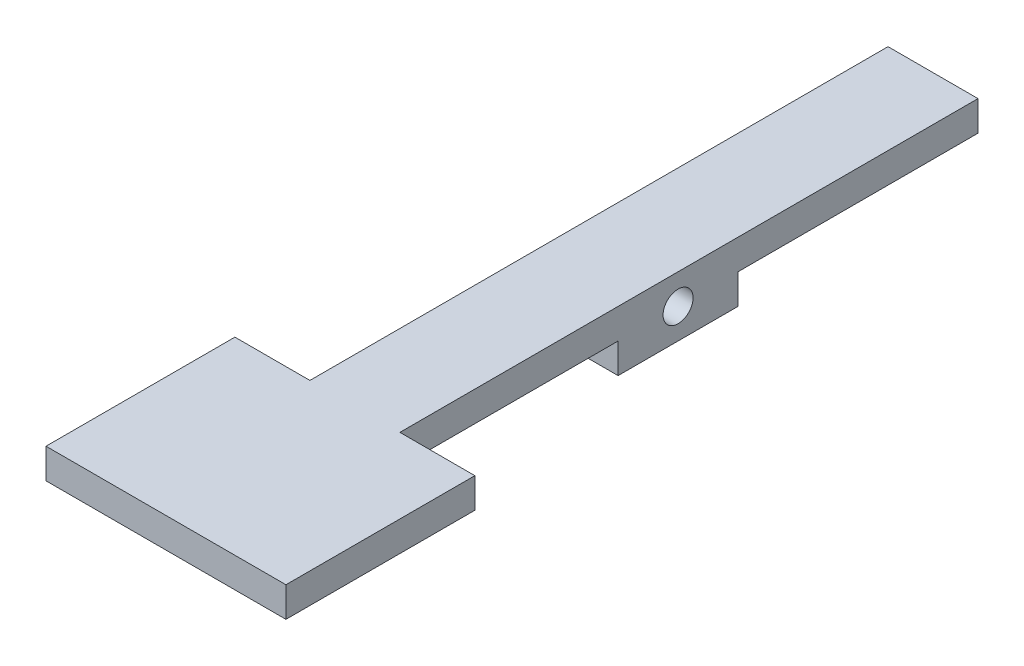
ISO-10303-21;
HEADER;
FILE_DESCRIPTION(('STEP AP214'),'2;1');
FILE_NAME('part.step','',(''),(''),'','','');
FILE_SCHEMA(('AUTOMOTIVE_DESIGN { 1 0 10303 214 1 1 1 1 }'));
ENDSEC;
DATA;
#1=APPLICATION_CONTEXT('core data for automotive mechanical design processes');
#2=APPLICATION_PROTOCOL_DEFINITION('international standard','automotive_design',2000,#1);
#3=PRODUCT_CONTEXT('',#1,'mechanical');
#4=PRODUCT('Part','Part','',(#3));
#5=PRODUCT_RELATED_PRODUCT_CATEGORY('part','',(#4));
#6=PRODUCT_DEFINITION_FORMATION('','',#4);
#7=PRODUCT_DEFINITION_CONTEXT('part definition',#1,'design');
#8=PRODUCT_DEFINITION('design','',#6,#7);
#9=PRODUCT_DEFINITION_SHAPE('','',#8);
#10=(LENGTH_UNIT() NAMED_UNIT(*) SI_UNIT(.MILLI.,.METRE.));
#11=(NAMED_UNIT(*) PLANE_ANGLE_UNIT() SI_UNIT($,.RADIAN.));
#12=(NAMED_UNIT(*) SI_UNIT($,.STERADIAN.) SOLID_ANGLE_UNIT());
#13=UNCERTAINTY_MEASURE_WITH_UNIT(LENGTH_MEASURE(1.E-05),#10,'distance_accuracy_value','');
#14=(GEOMETRIC_REPRESENTATION_CONTEXT(3) GLOBAL_UNCERTAINTY_ASSIGNED_CONTEXT((#13)) GLOBAL_UNIT_ASSIGNED_CONTEXT((#10,
#11,#12)) REPRESENTATION_CONTEXT('',''));
#15=CARTESIAN_POINT('',(0.,0.,0.));
#16=DIRECTION('',(0.,0.,1.));
#17=DIRECTION('',(1.,0.,0.));
#18=AXIS2_PLACEMENT_3D('',#15,#16,#17);
#19=CARTESIAN_POINT('',(9.525,0.,0.));
#20=DIRECTION('',(1.,0.,0.));
#21=DIRECTION('',(0.,0.,-1.));
#22=AXIS2_PLACEMENT_3D('',#19,#20,#21);
#23=PLANE('',#22);
#24=CARTESIAN_POINT('',(9.525,-1.5875,31.75));
#25=DIRECTION('',(1.,0.,0.));
#26=DIRECTION('',(0.,0.,-1.));
#27=AXIS2_PLACEMENT_3D('',#24,#25,#26);
#28=CIRCLE('',#27,1.5875);
#29=CARTESIAN_POINT('',(9.525,-1.5875,33.3375));
#30=VERTEX_POINT('',#29);
#31=EDGE_CURVE('E177',#30,#30,#28,.T.);
#32=ORIENTED_EDGE('',*,*,#31,.F.);
#33=EDGE_LOOP('',(#32));
#34=FACE_BOUND('',#33,.T.);
#35=DIRECTION('',(0.,0.,-1.));
#36=VECTOR('',#35,1.);
#37=CARTESIAN_POINT('',(9.525,1.5875,0.));
#38=LINE('',#37,#36);
#39=CARTESIAN_POINT('',(9.525,1.5875,61.2));
#40=VERTEX_POINT('',#39);
#41=CARTESIAN_POINT('',(9.525,1.5875,0.));
#42=VERTEX_POINT('',#41);
#43=EDGE_CURVE('E71',#40,#42,#38,.T.);
#44=ORIENTED_EDGE('',*,*,#43,.F.);
#45=DIRECTION('',(0.,-1.,0.));
#46=VECTOR('',#45,1.);
#47=CARTESIAN_POINT('',(9.525,0.,61.2));
#48=LINE('',#47,#46);
#49=CARTESIAN_POINT('',(9.525,-1.58750000000001,61.2));
#50=VERTEX_POINT('',#49);
#51=EDGE_CURVE('E66',#40,#50,#48,.T.);
#52=ORIENTED_EDGE('',*,*,#51,.T.);
#53=DIRECTION('',(0.,0.,1.));
#54=VECTOR('',#53,1.);
#55=CARTESIAN_POINT('',(9.525,-1.5875,0.));
#56=LINE('',#55,#54);
#57=CARTESIAN_POINT('',(9.525,-1.5875,38.1));
#58=VERTEX_POINT('',#57);
#59=EDGE_CURVE('E184',#58,#50,#56,.T.);
#60=ORIENTED_EDGE('',*,*,#59,.F.);
#61=DIRECTION('',(0.,-1.,0.));
#62=VECTOR('',#61,1.);
#63=CARTESIAN_POINT('',(9.525,0.,38.1));
#64=LINE('',#63,#62);
#65=CARTESIAN_POINT('',(9.525,-4.7625,38.1));
#66=VERTEX_POINT('',#65);
#67=EDGE_CURVE('E187',#58,#66,#64,.T.);
#68=ORIENTED_EDGE('',*,*,#67,.T.);
#69=DIRECTION('',(0.,0.,-1.));
#70=VECTOR('',#69,1.);
#71=CARTESIAN_POINT('',(9.525,-4.7625,0.));
#72=LINE('',#71,#70);
#73=CARTESIAN_POINT('',(9.525,-4.7625,25.4));
#74=VERTEX_POINT('',#73);
#75=EDGE_CURVE('E191',#66,#74,#72,.T.);
#76=ORIENTED_EDGE('',*,*,#75,.T.);
#77=DIRECTION('',(0.,-1.,0.));
#78=VECTOR('',#77,1.);
#79=CARTESIAN_POINT('',(9.525,0.,25.4));
#80=LINE('',#79,#78);
#81=CARTESIAN_POINT('',(9.525,-1.5875,25.4));
#82=VERTEX_POINT('',#81);
#83=EDGE_CURVE('E194',#82,#74,#80,.T.);
#84=ORIENTED_EDGE('',*,*,#83,.F.);
#85=DIRECTION('',(0.,0.,1.));
#86=VECTOR('',#85,1.);
#87=CARTESIAN_POINT('',(9.525,-1.5875,0.));
#88=LINE('',#87,#86);
#89=CARTESIAN_POINT('',(9.525,-1.5875,0.));
#90=VERTEX_POINT('',#89);
#91=EDGE_CURVE('E198',#90,#82,#88,.T.);
#92=ORIENTED_EDGE('',*,*,#91,.F.);
#93=DIRECTION('',(0.,-1.,0.));
#94=VECTOR('',#93,1.);
#95=CARTESIAN_POINT('',(9.525,0.,0.));
#96=LINE('',#95,#94);
#97=EDGE_CURVE('E202',#42,#90,#96,.T.);
#98=ORIENTED_EDGE('',*,*,#97,.F.);
#99=EDGE_LOOP('',(#44,#52,#60,#68,#76,#84,#92,#98));
#100=FACE_BOUND('',#99,.T.);
#101=ADVANCED_FACE('F50',(#34,#100),#23,.T.);
#102=CARTESIAN_POINT('',(0.,0.,0.));
#103=DIRECTION('',(1.,0.,0.));
#104=DIRECTION('',(0.,0.,-1.));
#105=AXIS2_PLACEMENT_3D('',#102,#103,#104);
#106=PLANE('',#105);
#107=CARTESIAN_POINT('',(0.,-1.5875,31.75));
#108=DIRECTION('',(1.,0.,0.));
#109=DIRECTION('',(0.,0.,-1.));
#110=AXIS2_PLACEMENT_3D('',#107,#108,#109);
#111=CIRCLE('',#110,1.5875);
#112=CARTESIAN_POINT('',(0.,-1.5875,33.3375));
#113=VERTEX_POINT('',#112);
#114=EDGE_CURVE('E171',#113,#113,#111,.T.);
#115=ORIENTED_EDGE('',*,*,#114,.T.);
#116=EDGE_LOOP('',(#115));
#117=FACE_BOUND('',#116,.T.);
#118=DIRECTION('',(0.,-1.,0.));
#119=VECTOR('',#118,1.);
#120=CARTESIAN_POINT('',(0.,0.,61.2));
#121=LINE('',#120,#119);
#122=CARTESIAN_POINT('',(0.,1.5875,61.2));
#123=VERTEX_POINT('',#122);
#124=CARTESIAN_POINT('',(0.,-1.5875,61.2));
#125=VERTEX_POINT('',#124);
#126=EDGE_CURVE('E11',#123,#125,#121,.T.);
#127=ORIENTED_EDGE('',*,*,#126,.F.);
#128=DIRECTION('',(0.,0.,-1.));
#129=VECTOR('',#128,1.);
#130=CARTESIAN_POINT('',(0.,1.5875,0.));
#131=LINE('',#130,#129);
#132=CARTESIAN_POINT('',(0.,1.5875,0.));
#133=VERTEX_POINT('',#132);
#134=EDGE_CURVE('E210',#123,#133,#131,.T.);
#135=ORIENTED_EDGE('',*,*,#134,.T.);
#136=DIRECTION('',(0.,-1.,0.));
#137=VECTOR('',#136,1.);
#138=CARTESIAN_POINT('',(0.,0.,0.));
#139=LINE('',#138,#137);
#140=CARTESIAN_POINT('',(0.,-1.5875,0.));
#141=VERTEX_POINT('',#140);
#142=EDGE_CURVE('E181',#133,#141,#139,.T.);
#143=ORIENTED_EDGE('',*,*,#142,.T.);
#144=DIRECTION('',(0.,0.,1.));
#145=VECTOR('',#144,1.);
#146=CARTESIAN_POINT('',(0.,-1.5875,0.));
#147=LINE('',#146,#145);
#148=CARTESIAN_POINT('',(0.,-1.5875,25.4));
#149=VERTEX_POINT('',#148);
#150=EDGE_CURVE('E228',#141,#149,#147,.T.);
#151=ORIENTED_EDGE('',*,*,#150,.T.);
#152=DIRECTION('',(0.,-1.,0.));
#153=VECTOR('',#152,1.);
#154=CARTESIAN_POINT('',(0.,0.,25.4));
#155=LINE('',#154,#153);
#156=CARTESIAN_POINT('',(0.,-4.7625,25.4));
#157=VERTEX_POINT('',#156);
#158=EDGE_CURVE('E224',#149,#157,#155,.T.);
#159=ORIENTED_EDGE('',*,*,#158,.T.);
#160=DIRECTION('',(0.,0.,-1.));
#161=VECTOR('',#160,1.);
#162=CARTESIAN_POINT('',(0.,-4.7625,0.));
#163=LINE('',#162,#161);
#164=CARTESIAN_POINT('',(0.,-4.7625,38.1));
#165=VERTEX_POINT('',#164);
#166=EDGE_CURVE('E220',#165,#157,#163,.T.);
#167=ORIENTED_EDGE('',*,*,#166,.F.);
#168=DIRECTION('',(0.,-1.,0.));
#169=VECTOR('',#168,1.);
#170=CARTESIAN_POINT('',(0.,0.,38.1));
#171=LINE('',#170,#169);
#172=CARTESIAN_POINT('',(0.,-1.5875,38.1));
#173=VERTEX_POINT('',#172);
#174=EDGE_CURVE('E216',#173,#165,#171,.T.);
#175=ORIENTED_EDGE('',*,*,#174,.F.);
#176=DIRECTION('',(0.,0.,1.));
#177=VECTOR('',#176,1.);
#178=CARTESIAN_POINT('',(0.,-1.5875,0.));
#179=LINE('',#178,#177);
#180=EDGE_CURVE('E213',#173,#125,#179,.T.);
#181=ORIENTED_EDGE('',*,*,#180,.T.);
#182=EDGE_LOOP('',(#127,#135,#143,#151,#159,#167,#175,#181));
#183=FACE_BOUND('',#182,.T.);
#184=ADVANCED_FACE('F260',(#117,#183),#106,.F.);
#185=CARTESIAN_POINT('',(9.525,1.5875,0.));
#186=DIRECTION('',(0.,1.,0.));
#187=DIRECTION('',(0.,0.,1.));
#188=AXIS2_PLACEMENT_3D('',#185,#186,#187);
#189=PLANE('',#188);
#190=DIRECTION('',(-1.,0.,0.));
#191=VECTOR('',#190,1.);
#192=CARTESIAN_POINT('',(17.4625,1.5875,61.2));
#193=LINE('',#192,#191);
#194=CARTESIAN_POINT('',(17.4625,1.5875,61.2));
#195=VERTEX_POINT('',#194);
#196=EDGE_CURVE('E271',#195,#40,#193,.T.);
#197=ORIENTED_EDGE('',*,*,#196,.T.);
#198=ORIENTED_EDGE('',*,*,#43,.T.);
#199=DIRECTION('',(-1.,0.,0.));
#200=VECTOR('',#199,1.);
#201=CARTESIAN_POINT('',(9.525,1.5875,0.));
#202=LINE('',#201,#200);
#203=EDGE_CURVE('E206',#42,#133,#202,.T.);
#204=ORIENTED_EDGE('',*,*,#203,.T.);
#205=ORIENTED_EDGE('',*,*,#134,.F.);
#206=CARTESIAN_POINT('',(-7.9375,1.5875,61.2));
#207=VERTEX_POINT('',#206);
#208=EDGE_CURVE('E276',#123,#207,#193,.T.);
#209=ORIENTED_EDGE('',*,*,#208,.T.);
#210=DIRECTION('',(0.,0.,1.));
#211=VECTOR('',#210,1.);
#212=CARTESIAN_POINT('',(-7.9375,1.58750000000001,0.));
#213=LINE('',#212,#211);
#214=CARTESIAN_POINT('',(-7.9375,1.5875,81.2));
#215=VERTEX_POINT('',#214);
#216=EDGE_CURVE('E165',#207,#215,#213,.T.);
#217=ORIENTED_EDGE('',*,*,#216,.T.);
#218=DIRECTION('',(-1.,0.,0.));
#219=VECTOR('',#218,1.);
#220=CARTESIAN_POINT('',(17.4625,1.5875,81.2));
#221=LINE('',#220,#219);
#222=CARTESIAN_POINT('',(17.4625,1.5875,81.2));
#223=VERTEX_POINT('',#222);
#224=EDGE_CURVE('E143',#223,#215,#221,.T.);
#225=ORIENTED_EDGE('',*,*,#224,.F.);
#226=DIRECTION('',(0.,0.,1.));
#227=VECTOR('',#226,1.);
#228=CARTESIAN_POINT('',(17.4625,1.58750000000001,0.));
#229=LINE('',#228,#227);
#230=EDGE_CURVE('E151',#195,#223,#229,.T.);
#231=ORIENTED_EDGE('',*,*,#230,.F.);
#232=EDGE_LOOP('',(#197,#198,#204,#205,#209,#217,#225,#231));
#233=FACE_BOUND('',#232,.T.);
#234=ADVANCED_FACE('F163',(#233),#189,.T.);
#235=CARTESIAN_POINT('',(9.525,-1.5875,0.));
#236=DIRECTION('',(0.,-1.,0.));
#237=DIRECTION('',(0.,0.,-1.));
#238=AXIS2_PLACEMENT_3D('',#235,#236,#237);
#239=PLANE('',#238);
#240=DIRECTION('',(-1.,0.,0.));
#241=VECTOR('',#240,1.);
#242=CARTESIAN_POINT('',(17.4625,-1.5875,61.2));
#243=LINE('',#242,#241);
#244=CARTESIAN_POINT('',(-7.9375,-1.5875,61.2));
#245=VERTEX_POINT('',#244);
#246=EDGE_CURVE('E264',#125,#245,#243,.T.);
#247=ORIENTED_EDGE('',*,*,#246,.F.);
#248=ORIENTED_EDGE('',*,*,#180,.F.);
#249=DIRECTION('',(-1.,0.,0.));
#250=VECTOR('',#249,1.);
#251=CARTESIAN_POINT('',(9.525,-1.5875,38.1));
#252=LINE('',#251,#250);
#253=EDGE_CURVE('E59',#58,#173,#252,.T.);
#254=ORIENTED_EDGE('',*,*,#253,.F.);
#255=ORIENTED_EDGE('',*,*,#59,.T.);
#256=CARTESIAN_POINT('',(17.4625,-1.5875,61.2));
#257=VERTEX_POINT('',#256);
#258=EDGE_CURVE('E173',#257,#50,#243,.T.);
#259=ORIENTED_EDGE('',*,*,#258,.F.);
#260=DIRECTION('',(0.,0.,-1.));
#261=VECTOR('',#260,1.);
#262=CARTESIAN_POINT('',(17.4625,-1.5875,0.));
#263=LINE('',#262,#261);
#264=CARTESIAN_POINT('',(17.4625,-1.58750000000001,81.2));
#265=VERTEX_POINT('',#264);
#266=EDGE_CURVE('E150',#265,#257,#263,.T.);
#267=ORIENTED_EDGE('',*,*,#266,.F.);
#268=DIRECTION('',(-1.,0.,0.));
#269=VECTOR('',#268,1.);
#270=CARTESIAN_POINT('',(17.4625,-1.58750000000001,81.2));
#271=LINE('',#270,#269);
#272=CARTESIAN_POINT('',(-7.9375,-1.58750000000001,81.2));
#273=VERTEX_POINT('',#272);
#274=EDGE_CURVE('E146',#265,#273,#271,.T.);
#275=ORIENTED_EDGE('',*,*,#274,.T.);
#276=DIRECTION('',(0.,0.,-1.));
#277=VECTOR('',#276,1.);
#278=CARTESIAN_POINT('',(-7.9375,-1.5875,0.));
#279=LINE('',#278,#277);
#280=EDGE_CURVE('E266',#273,#245,#279,.T.);
#281=ORIENTED_EDGE('',*,*,#280,.T.);
#282=EDGE_LOOP('',(#247,#248,#254,#255,#259,#267,#275,#281));
#283=FACE_BOUND('',#282,.T.);
#284=ADVANCED_FACE('F262',(#283),#239,.T.);
#285=CARTESIAN_POINT('',(9.525,0.,38.1));
#286=DIRECTION('',(0.,0.,-1.));
#287=DIRECTION('',(-1.,0.,0.));
#288=AXIS2_PLACEMENT_3D('',#285,#286,#287);
#289=PLANE('',#288);
#290=ORIENTED_EDGE('',*,*,#174,.T.);
#291=DIRECTION('',(-1.,0.,0.));
#292=VECTOR('',#291,1.);
#293=CARTESIAN_POINT('',(9.525,-4.7625,38.1));
#294=LINE('',#293,#292);
#295=EDGE_CURVE('E247',#66,#165,#294,.T.);
#296=ORIENTED_EDGE('',*,*,#295,.F.);
#297=ORIENTED_EDGE('',*,*,#67,.F.);
#298=ORIENTED_EDGE('',*,*,#253,.T.);
#299=EDGE_LOOP('',(#290,#296,#297,#298));
#300=FACE_BOUND('',#299,.T.);
#301=ADVANCED_FACE('F255',(#300),#289,.F.);
#302=CARTESIAN_POINT('',(9.525,-4.7625,0.));
#303=DIRECTION('',(0.,1.,0.));
#304=DIRECTION('',(0.,0.,1.));
#305=AXIS2_PLACEMENT_3D('',#302,#303,#304);
#306=PLANE('',#305);
#307=ORIENTED_EDGE('',*,*,#166,.T.);
#308=DIRECTION('',(-1.,0.,0.));
#309=VECTOR('',#308,1.);
#310=CARTESIAN_POINT('',(9.525,-4.7625,25.4));
#311=LINE('',#310,#309);
#312=EDGE_CURVE('E244',#74,#157,#311,.T.);
#313=ORIENTED_EDGE('',*,*,#312,.F.);
#314=ORIENTED_EDGE('',*,*,#75,.F.);
#315=ORIENTED_EDGE('',*,*,#295,.T.);
#316=EDGE_LOOP('',(#307,#313,#314,#315));
#317=FACE_BOUND('',#316,.T.);
#318=ADVANCED_FACE('F339',(#317),#306,.F.);
#319=CARTESIAN_POINT('',(9.525,0.,25.4));
#320=DIRECTION('',(0.,0.,-1.));
#321=DIRECTION('',(-1.,0.,0.));
#322=AXIS2_PLACEMENT_3D('',#319,#320,#321);
#323=PLANE('',#322);
#324=ORIENTED_EDGE('',*,*,#158,.F.);
#325=DIRECTION('',(-1.,0.,0.));
#326=VECTOR('',#325,1.);
#327=CARTESIAN_POINT('',(9.525,-1.5875,25.4));
#328=LINE('',#327,#326);
#329=EDGE_CURVE('E241',#82,#149,#328,.T.);
#330=ORIENTED_EDGE('',*,*,#329,.F.);
#331=ORIENTED_EDGE('',*,*,#83,.T.);
#332=ORIENTED_EDGE('',*,*,#312,.T.);
#333=EDGE_LOOP('',(#324,#330,#331,#332));
#334=FACE_BOUND('',#333,.T.);
#335=ADVANCED_FACE('F336',(#334),#323,.T.);
#336=CARTESIAN_POINT('',(9.525,-1.5875,0.));
#337=DIRECTION('',(0.,-1.,0.));
#338=DIRECTION('',(0.,0.,-1.));
#339=AXIS2_PLACEMENT_3D('',#336,#337,#338);
#340=PLANE('',#339);
#341=ORIENTED_EDGE('',*,*,#150,.F.);
#342=DIRECTION('',(-1.,0.,0.));
#343=VECTOR('',#342,1.);
#344=CARTESIAN_POINT('',(9.525,-1.5875,0.));
#345=LINE('',#344,#343);
#346=EDGE_CURVE('E238',#90,#141,#345,.T.);
#347=ORIENTED_EDGE('',*,*,#346,.F.);
#348=ORIENTED_EDGE('',*,*,#91,.T.);
#349=ORIENTED_EDGE('',*,*,#329,.T.);
#350=EDGE_LOOP('',(#341,#347,#348,#349));
#351=FACE_BOUND('',#350,.T.);
#352=ADVANCED_FACE('F304',(#351),#340,.T.);
#353=CARTESIAN_POINT('',(9.525,-1.5875,31.75));
#354=DIRECTION('',(-1.,0.,0.));
#355=DIRECTION('',(0.,0.,1.));
#356=AXIS2_PLACEMENT_3D('',#353,#354,#355);
#357=CYLINDRICAL_SURFACE('',#356,1.5875);
#358=CARTESIAN_POINT('',(9.525,-1.5875,33.3375));
#359=CARTESIAN_POINT('',(9.42578125,-1.5875,33.3375));
#360=CARTESIAN_POINT('',(9.3265625,-1.5875,33.3375));
#361=CARTESIAN_POINT('',(9.128125,-1.5875,33.3375));
#362=CARTESIAN_POINT('',(9.02890625,-1.5875,33.3375));
#363=CARTESIAN_POINT('',(8.83046875,-1.5875,33.3375));
#364=CARTESIAN_POINT('',(8.73125,-1.5875,33.3375));
#365=CARTESIAN_POINT('',(8.5328125,-1.5875,33.3375));
#366=CARTESIAN_POINT('',(8.43359375,-1.5875,33.3375));
#367=CARTESIAN_POINT('',(8.23515625,-1.5875,33.3375));
#368=CARTESIAN_POINT('',(8.1359375,-1.5875,33.3375));
#369=CARTESIAN_POINT('',(7.9375,-1.5875,33.3375));
#370=CARTESIAN_POINT('',(7.83828125,-1.5875,33.3375));
#371=CARTESIAN_POINT('',(7.63984375,-1.5875,33.3375));
#372=CARTESIAN_POINT('',(7.540625,-1.5875,33.3375));
#373=CARTESIAN_POINT('',(7.3421875,-1.5875,33.3375));
#374=CARTESIAN_POINT('',(7.24296875,-1.5875,33.3375));
#375=CARTESIAN_POINT('',(7.04453125,-1.5875,33.3375));
#376=CARTESIAN_POINT('',(6.9453125,-1.5875,33.3375));
#377=CARTESIAN_POINT('',(6.746875,-1.5875,33.3375));
#378=CARTESIAN_POINT('',(6.64765625,-1.5875,33.3375));
#379=CARTESIAN_POINT('',(6.44921875,-1.5875,33.3375));
#380=CARTESIAN_POINT('',(6.35,-1.5875,33.3375));
#381=CARTESIAN_POINT('',(6.1515625,-1.5875,33.3375));
#382=CARTESIAN_POINT('',(6.05234375,-1.5875,33.3375));
#383=CARTESIAN_POINT('',(5.85390625,-1.5875,33.3375));
#384=CARTESIAN_POINT('',(5.7546875,-1.5875,33.3375));
#385=CARTESIAN_POINT('',(5.55625,-1.5875,33.3375));
#386=CARTESIAN_POINT('',(5.45703125,-1.5875,33.3375));
#387=CARTESIAN_POINT('',(5.25859375,-1.5875,33.3375));
#388=CARTESIAN_POINT('',(5.159375,-1.5875,33.3375));
#389=CARTESIAN_POINT('',(4.9609375,-1.5875,33.3375));
#390=CARTESIAN_POINT('',(4.86171875,-1.5875,33.3375));
#391=CARTESIAN_POINT('',(4.66328125,-1.5875,33.3375));
#392=CARTESIAN_POINT('',(4.5640625,-1.5875,33.3375));
#393=CARTESIAN_POINT('',(4.365625,-1.5875,33.3375));
#394=CARTESIAN_POINT('',(4.26640625,-1.5875,33.3375));
#395=CARTESIAN_POINT('',(4.06796875,-1.5875,33.3375));
#396=CARTESIAN_POINT('',(3.96875,-1.5875,33.3375));
#397=CARTESIAN_POINT('',(3.7703125,-1.5875,33.3375));
#398=CARTESIAN_POINT('',(3.67109375,-1.5875,33.3375));
#399=CARTESIAN_POINT('',(3.47265625,-1.5875,33.3375));
#400=CARTESIAN_POINT('',(3.3734375,-1.5875,33.3375));
#401=CARTESIAN_POINT('',(3.175,-1.5875,33.3375));
#402=CARTESIAN_POINT('',(3.07578125,-1.5875,33.3375));
#403=CARTESIAN_POINT('',(2.87734375,-1.5875,33.3375));
#404=CARTESIAN_POINT('',(2.778125,-1.5875,33.3375));
#405=CARTESIAN_POINT('',(2.5796875,-1.5875,33.3375));
#406=CARTESIAN_POINT('',(2.48046875,-1.5875,33.3375));
#407=CARTESIAN_POINT('',(2.28203125,-1.5875,33.3375));
#408=CARTESIAN_POINT('',(2.1828125,-1.5875,33.3375));
#409=CARTESIAN_POINT('',(1.984375,-1.5875,33.3375));
#410=CARTESIAN_POINT('',(1.88515625,-1.5875,33.3375));
#411=CARTESIAN_POINT('',(1.68671875,-1.5875,33.3375));
#412=CARTESIAN_POINT('',(1.5875,-1.5875,33.3375));
#413=CARTESIAN_POINT('',(1.3890625,-1.5875,33.3375));
#414=CARTESIAN_POINT('',(1.28984375,-1.5875,33.3375));
#415=CARTESIAN_POINT('',(1.09140625,-1.5875,33.3375));
#416=CARTESIAN_POINT('',(0.992187500000001,-1.5875,33.3375));
#417=CARTESIAN_POINT('',(0.793750000000001,-1.5875,33.3375));
#418=CARTESIAN_POINT('',(0.69453125,-1.5875,33.3375));
#419=CARTESIAN_POINT('',(0.49609375,-1.5875,33.3375));
#420=CARTESIAN_POINT('',(0.396875,-1.5875,33.3375));
#421=CARTESIAN_POINT('',(0.1984375,-1.5875,33.3375));
#422=CARTESIAN_POINT('',(0.0992187500000001,-1.5875,33.3375));
#423=CARTESIAN_POINT('',(0.,-1.5875,33.3375));
#424=B_SPLINE_CURVE_WITH_KNOTS('',3,(#358,#359,#360,#361,#362,#363,#364,#365,#366,#367,#368,
#369,#370,#371,#372,#373,#374,#375,#376,#377,#378,#379,#380,#381,#382,#383,#384,#385,#386,#387,
#388,#389,#390,#391,#392,#393,#394,#395,#396,#397,#398,#399,#400,#401,#402,#403,#404,#405,#406,
#407,#408,#409,#410,#411,#412,#413,#414,#415,#416,#417,#418,#419,#420,#421,#422,#423),
.UNSPECIFIED.,.F.,.F.,(4,2,2,2,2,2,2,2,2,2,2,2,2,2,2,2,2,2,2,2,2,2,2,2,2,2,2,2,2,2,2,2,4),(0.,
0.297656249999998,0.595312499999999,0.892968749999999,1.190625,1.48828125,1.7859375,2.08359375,
2.38125,2.67890625,2.9765625,3.27421875,3.571875,3.86953125,4.1671875,4.46484375,4.7625,
5.06015625,5.3578125,5.65546875,5.953125,6.25078125,6.5484375,6.84609375,7.14375,7.44140625,
7.7390625,8.03671875,8.334375,8.63203125,8.9296875,9.22734375,9.525),.UNSPECIFIED.);
#425=EDGE_CURVE('BSEAM52',#30,#113,#424,.T.);
#426=ORIENTED_EDGE('',*,*,#31,.T.);
#427=ORIENTED_EDGE('',*,*,#114,.F.);
#428=ORIENTED_EDGE('',*,*,#425,.T.);
#429=ORIENTED_EDGE('',*,*,#425,.F.);
#430=EDGE_LOOP('',(#426,#428,#427,#429));
#431=FACE_BOUND('',#430,.T.);
#432=ADVANCED_FACE('F52',(#431),#357,.F.);
#433=CARTESIAN_POINT('',(9.525,0.,0.));
#434=DIRECTION('',(0.,0.,-1.));
#435=DIRECTION('',(0.,1.,0.));
#436=AXIS2_PLACEMENT_3D('',#433,#434,#435);
#437=PLANE('',#436);
#438=ORIENTED_EDGE('',*,*,#142,.F.);
#439=ORIENTED_EDGE('',*,*,#203,.F.);
#440=ORIENTED_EDGE('',*,*,#97,.T.);
#441=ORIENTED_EDGE('',*,*,#346,.T.);
#442=EDGE_LOOP('',(#438,#439,#440,#441));
#443=FACE_BOUND('',#442,.T.);
#444=ADVANCED_FACE('F299',(#443),#437,.T.);
#445=CARTESIAN_POINT('',(17.4625,0.,61.2));
#446=DIRECTION('',(0.,0.,1.));
#447=DIRECTION('',(1.,0.,0.));
#448=AXIS2_PLACEMENT_3D('',#445,#446,#447);
#449=PLANE('',#448);
#450=ORIENTED_EDGE('',*,*,#208,.F.);
#451=ORIENTED_EDGE('',*,*,#126,.T.);
#452=ORIENTED_EDGE('',*,*,#246,.T.);
#453=DIRECTION('',(0.,1.,0.));
#454=VECTOR('',#453,1.);
#455=CARTESIAN_POINT('',(-7.9375,0.,61.2));
#456=LINE('',#455,#454);
#457=EDGE_CURVE('E161',#245,#207,#456,.T.);
#458=ORIENTED_EDGE('',*,*,#457,.T.);
#459=EDGE_LOOP('',(#450,#451,#452,#458));
#460=FACE_BOUND('',#459,.T.);
#461=ADVANCED_FACE('F307',(#460),#449,.F.);
#462=CARTESIAN_POINT('',(17.4625,0.,81.2));
#463=DIRECTION('',(0.,0.,-1.));
#464=DIRECTION('',(-1.,0.,0.));
#465=AXIS2_PLACEMENT_3D('',#462,#463,#464);
#466=PLANE('',#465);
#467=DIRECTION('',(0.,-1.,0.));
#468=VECTOR('',#467,1.);
#469=CARTESIAN_POINT('',(-7.9375,0.,81.2));
#470=LINE('',#469,#468);
#471=EDGE_CURVE('E283',#215,#273,#470,.T.);
#472=ORIENTED_EDGE('',*,*,#471,.T.);
#473=ORIENTED_EDGE('',*,*,#274,.F.);
#474=DIRECTION('',(0.,-1.,0.));
#475=VECTOR('',#474,1.);
#476=CARTESIAN_POINT('',(17.4625,0.,81.2));
#477=LINE('',#476,#475);
#478=EDGE_CURVE('E139',#223,#265,#477,.T.);
#479=ORIENTED_EDGE('',*,*,#478,.F.);
#480=ORIENTED_EDGE('',*,*,#224,.T.);
#481=EDGE_LOOP('',(#472,#473,#479,#480));
#482=FACE_BOUND('',#481,.T.);
#483=ADVANCED_FACE('F141',(#482),#466,.F.);
#484=ORIENTED_EDGE('',*,*,#51,.F.);
#485=ORIENTED_EDGE('',*,*,#196,.F.);
#486=DIRECTION('',(0.,1.,0.));
#487=VECTOR('',#486,1.);
#488=CARTESIAN_POINT('',(17.4625,0.,61.2));
#489=LINE('',#488,#487);
#490=EDGE_CURVE('E156',#257,#195,#489,.T.);
#491=ORIENTED_EDGE('',*,*,#490,.F.);
#492=ORIENTED_EDGE('',*,*,#258,.T.);
#493=EDGE_LOOP('',(#484,#485,#491,#492));
#494=FACE_BOUND('',#493,.T.);
#495=ADVANCED_FACE('F294',(#494),#449,.F.);
#496=CARTESIAN_POINT('',(17.4625,0.,0.));
#497=DIRECTION('',(1.,0.,0.));
#498=DIRECTION('',(0.,0.,-1.));
#499=AXIS2_PLACEMENT_3D('',#496,#497,#498);
#500=PLANE('',#499);
#501=ORIENTED_EDGE('',*,*,#230,.T.);
#502=ORIENTED_EDGE('',*,*,#478,.T.);
#503=ORIENTED_EDGE('',*,*,#266,.T.);
#504=ORIENTED_EDGE('',*,*,#490,.T.);
#505=EDGE_LOOP('',(#501,#502,#503,#504));
#506=FACE_BOUND('',#505,.T.);
#507=ADVANCED_FACE('F154',(#506),#500,.T.);
#508=CARTESIAN_POINT('',(-7.9375,0.,0.));
#509=DIRECTION('',(1.,0.,0.));
#510=DIRECTION('',(0.,0.,-1.));
#511=AXIS2_PLACEMENT_3D('',#508,#509,#510);
#512=PLANE('',#511);
#513=ORIENTED_EDGE('',*,*,#216,.F.);
#514=ORIENTED_EDGE('',*,*,#457,.F.);
#515=ORIENTED_EDGE('',*,*,#280,.F.);
#516=ORIENTED_EDGE('',*,*,#471,.F.);
#517=EDGE_LOOP('',(#513,#514,#515,#516));
#518=FACE_BOUND('',#517,.T.);
#519=ADVANCED_FACE('F313',(#518),#512,.F.);
#520=CLOSED_SHELL('',(#101,#184,#234,#284,#301,#318,#335,#352,#432,#444,#461,#483,#495,#507,#519));
#521=MANIFOLD_SOLID_BREP('B2',#520);
#522=ADVANCED_BREP_SHAPE_REPRESENTATION('',(#18,#521),#14);
#523=SHAPE_DEFINITION_REPRESENTATION(#9,#522);
ENDSEC;
END-ISO-10303-21;
